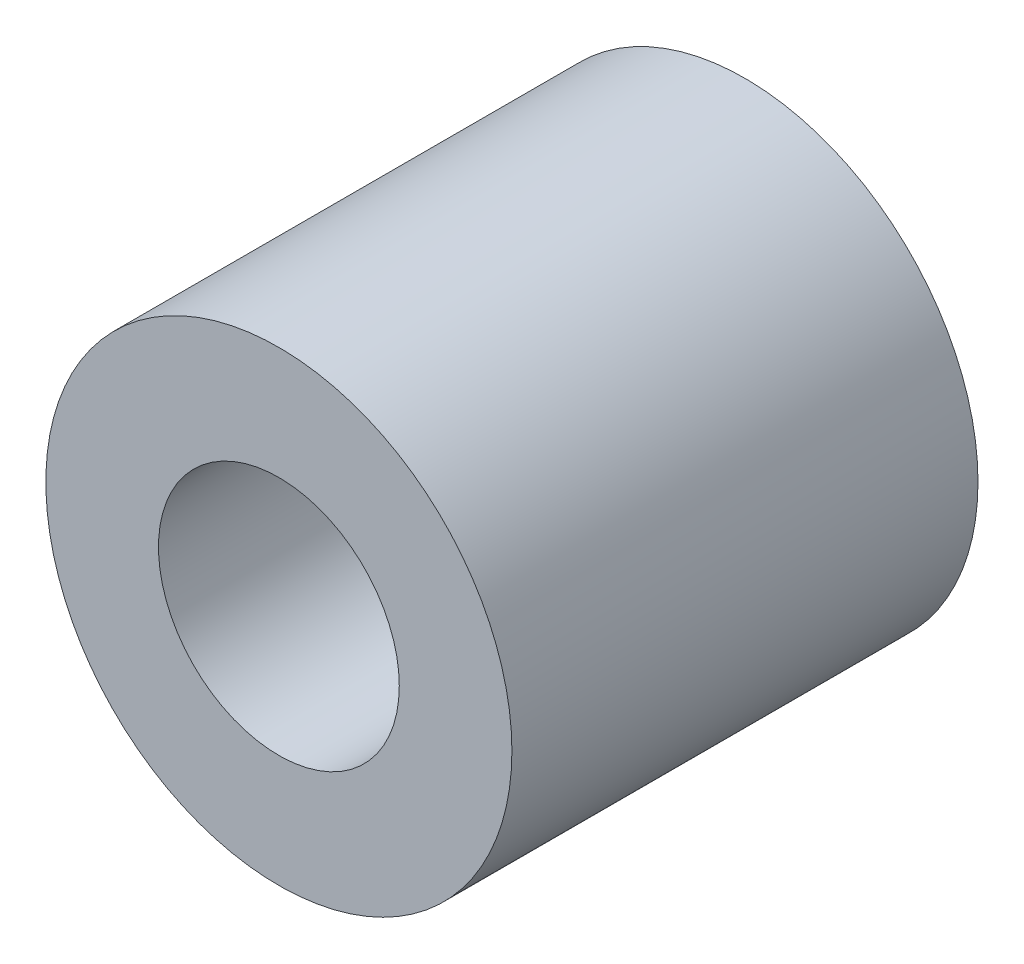
ISO-10303-21;
HEADER;
FILE_DESCRIPTION(('STEP AP214'),'2;1');
FILE_NAME('part.step','',(''),(''),'','','');
FILE_SCHEMA(('AUTOMOTIVE_DESIGN { 1 0 10303 214 1 1 1 1 }'));
ENDSEC;
DATA;
#1=APPLICATION_CONTEXT('core data for automotive mechanical design processes');
#2=APPLICATION_PROTOCOL_DEFINITION('international standard','automotive_design',2000,#1);
#3=PRODUCT_CONTEXT('',#1,'mechanical');
#4=PRODUCT('Part','Part','',(#3));
#5=PRODUCT_RELATED_PRODUCT_CATEGORY('part','',(#4));
#6=PRODUCT_DEFINITION_FORMATION('','',#4);
#7=PRODUCT_DEFINITION_CONTEXT('part definition',#1,'design');
#8=PRODUCT_DEFINITION('design','',#6,#7);
#9=PRODUCT_DEFINITION_SHAPE('','',#8);
#10=(LENGTH_UNIT() NAMED_UNIT(*) SI_UNIT(.MILLI.,.METRE.));
#11=(NAMED_UNIT(*) PLANE_ANGLE_UNIT() SI_UNIT($,.RADIAN.));
#12=(NAMED_UNIT(*) SI_UNIT($,.STERADIAN.) SOLID_ANGLE_UNIT());
#13=UNCERTAINTY_MEASURE_WITH_UNIT(LENGTH_MEASURE(1.E-05),#10,'distance_accuracy_value','');
#14=(GEOMETRIC_REPRESENTATION_CONTEXT(3) GLOBAL_UNCERTAINTY_ASSIGNED_CONTEXT((#13)) GLOBAL_UNIT_ASSIGNED_CONTEXT((#10,
#11,#12)) REPRESENTATION_CONTEXT('',''));
#15=CARTESIAN_POINT('',(0.,0.,0.));
#16=DIRECTION('',(0.,0.,1.));
#17=DIRECTION('',(1.,0.,0.));
#18=AXIS2_PLACEMENT_3D('',#15,#16,#17);
#19=CARTESIAN_POINT('',(0.,0.,6.));
#20=DIRECTION('',(0.,0.,-1.));
#21=DIRECTION('',(-1.,0.,0.));
#22=AXIS2_PLACEMENT_3D('',#19,#20,#21);
#23=CYLINDRICAL_SURFACE('',#22,3.);
#24=CARTESIAN_POINT('',(0.,0.,6.));
#25=DIRECTION('',(0.,0.,1.));
#26=DIRECTION('',(1.,0.,0.));
#27=AXIS2_PLACEMENT_3D('',#24,#25,#26);
#28=CIRCLE('',#27,3.);
#29=CARTESIAN_POINT('',(3.,0.,6.));
#30=VERTEX_POINT('',#29);
#31=EDGE_CURVE('E10',#30,#30,#28,.T.);
#32=ORIENTED_EDGE('',*,*,#31,.F.);
#33=EDGE_LOOP('',(#32));
#34=FACE_BOUND('',#33,.T.);
#35=CARTESIAN_POINT('',(0.,0.,0.));
#36=DIRECTION('',(0.,0.,1.));
#37=DIRECTION('',(1.,0.,0.));
#38=AXIS2_PLACEMENT_3D('',#35,#36,#37);
#39=CIRCLE('',#38,3.);
#40=CARTESIAN_POINT('',(3.,0.,0.));
#41=VERTEX_POINT('',#40);
#42=EDGE_CURVE('E36',#41,#41,#39,.T.);
#43=ORIENTED_EDGE('',*,*,#42,.T.);
#44=EDGE_LOOP('',(#43));
#45=FACE_BOUND('',#44,.T.);
#46=ADVANCED_FACE('F33',(#34,#45),#23,.T.);
#47=CARTESIAN_POINT('',(0.,0.,6.));
#48=DIRECTION('',(0.,0.,1.));
#49=DIRECTION('',(1.,0.,0.));
#50=AXIS2_PLACEMENT_3D('',#47,#48,#49);
#51=PLANE('',#50);
#52=CARTESIAN_POINT('',(0.,0.,6.));
#53=DIRECTION('',(0.,0.,1.));
#54=DIRECTION('',(1.,0.,0.));
#55=AXIS2_PLACEMENT_3D('',#52,#53,#54);
#56=CIRCLE('',#55,1.55);
#57=CARTESIAN_POINT('',(1.55,0.,6.));
#58=VERTEX_POINT('',#57);
#59=EDGE_CURVE('E45',#58,#58,#56,.T.);
#60=ORIENTED_EDGE('',*,*,#59,.F.);
#61=EDGE_LOOP('',(#60));
#62=FACE_BOUND('',#61,.T.);
#63=ORIENTED_EDGE('',*,*,#31,.T.);
#64=EDGE_LOOP('',(#63));
#65=FACE_BOUND('',#64,.T.);
#66=ADVANCED_FACE('F60',(#62,#65),#51,.T.);
#67=CARTESIAN_POINT('',(0.,0.,0.));
#68=DIRECTION('',(0.,0.,1.));
#69=DIRECTION('',(1.,0.,0.));
#70=AXIS2_PLACEMENT_3D('',#67,#68,#69);
#71=PLANE('',#70);
#72=CARTESIAN_POINT('',(0.,0.,0.));
#73=DIRECTION('',(0.,0.,1.));
#74=DIRECTION('',(1.,0.,0.));
#75=AXIS2_PLACEMENT_3D('',#72,#73,#74);
#76=CIRCLE('',#75,1.55);
#77=CARTESIAN_POINT('',(1.55,0.,0.));
#78=VERTEX_POINT('',#77);
#79=EDGE_CURVE('E43',#78,#78,#76,.T.);
#80=ORIENTED_EDGE('',*,*,#79,.T.);
#81=EDGE_LOOP('',(#80));
#82=FACE_BOUND('',#81,.T.);
#83=ORIENTED_EDGE('',*,*,#42,.F.);
#84=EDGE_LOOP('',(#83));
#85=FACE_BOUND('',#84,.T.);
#86=ADVANCED_FACE('F51',(#82,#85),#71,.F.);
#87=CARTESIAN_POINT('',(0.,0.,0.));
#88=DIRECTION('',(0.,0.,1.));
#89=DIRECTION('',(1.,0.,0.));
#90=AXIS2_PLACEMENT_3D('',#87,#88,#89);
#91=CYLINDRICAL_SURFACE('',#90,1.55);
#92=ORIENTED_EDGE('',*,*,#79,.F.);
#93=EDGE_LOOP('',(#92));
#94=FACE_BOUND('',#93,.T.);
#95=ORIENTED_EDGE('',*,*,#59,.T.);
#96=EDGE_LOOP('',(#95));
#97=FACE_BOUND('',#96,.T.);
#98=ADVANCED_FACE('F54',(#94,#97),#91,.F.);
#99=CLOSED_SHELL('',(#46,#66,#86,#98));
#100=MANIFOLD_SOLID_BREP('B2',#99);
#101=ADVANCED_BREP_SHAPE_REPRESENTATION('',(#18,#100),#14);
#102=SHAPE_DEFINITION_REPRESENTATION(#9,#101);
ENDSEC;
END-ISO-10303-21;
